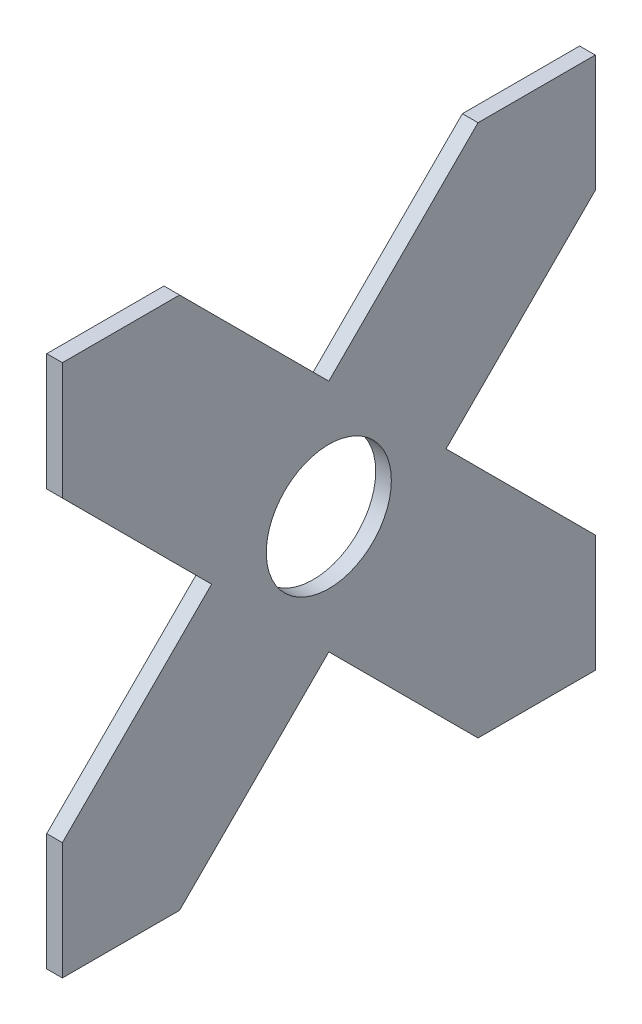
ISO-10303-21;
HEADER;
FILE_DESCRIPTION(('STEP AP214'),'2;1');
FILE_NAME('part.step','',(''),(''),'','','');
FILE_SCHEMA(('AUTOMOTIVE_DESIGN { 1 0 10303 214 1 1 1 1 }'));
ENDSEC;
DATA;
#1=APPLICATION_CONTEXT('core data for automotive mechanical design processes');
#2=APPLICATION_PROTOCOL_DEFINITION('international standard','automotive_design',2000,#1);
#3=PRODUCT_CONTEXT('',#1,'mechanical');
#4=PRODUCT('Part','Part','',(#3));
#5=PRODUCT_RELATED_PRODUCT_CATEGORY('part','',(#4));
#6=PRODUCT_DEFINITION_FORMATION('','',#4);
#7=PRODUCT_DEFINITION_CONTEXT('part definition',#1,'design');
#8=PRODUCT_DEFINITION('design','',#6,#7);
#9=PRODUCT_DEFINITION_SHAPE('','',#8);
#10=(LENGTH_UNIT() NAMED_UNIT(*) SI_UNIT(.MILLI.,.METRE.));
#11=(NAMED_UNIT(*) PLANE_ANGLE_UNIT() SI_UNIT($,.RADIAN.));
#12=(NAMED_UNIT(*) SI_UNIT($,.STERADIAN.) SOLID_ANGLE_UNIT());
#13=UNCERTAINTY_MEASURE_WITH_UNIT(LENGTH_MEASURE(1.E-05),#10,'distance_accuracy_value','');
#14=(GEOMETRIC_REPRESENTATION_CONTEXT(3) GLOBAL_UNCERTAINTY_ASSIGNED_CONTEXT((#13)) GLOBAL_UNIT_ASSIGNED_CONTEXT((#10,
#11,#12)) REPRESENTATION_CONTEXT('',''));
#15=CARTESIAN_POINT('',(0.,0.,0.));
#16=DIRECTION('',(0.,0.,1.));
#17=DIRECTION('',(1.,0.,0.));
#18=AXIS2_PLACEMENT_3D('',#15,#16,#17);
#19=CARTESIAN_POINT('',(10.,0.,0.));
#20=DIRECTION('',(0.,0.,-1.));
#21=DIRECTION('',(0.,1.,0.));
#22=AXIS2_PLACEMENT_3D('',#19,#20,#21);
#23=PLANE('',#22);
#24=DIRECTION('',(0.,-1.,0.));
#25=VECTOR('',#24,1.);
#26=CARTESIAN_POINT('',(0.,0.,0.));
#27=LINE('',#26,#25);
#28=CARTESIAN_POINT('',(0.,75.,0.));
#29=VERTEX_POINT('',#28);
#30=CARTESIAN_POINT('',(0.,0.,0.));
#31=VERTEX_POINT('',#30);
#32=EDGE_CURVE('E181',#29,#31,#27,.T.);
#33=ORIENTED_EDGE('',*,*,#32,.T.);
#34=DIRECTION('',(-1.,0.,0.));
#35=VECTOR('',#34,1.);
#36=CARTESIAN_POINT('',(10.,0.,0.));
#37=LINE('',#36,#35);
#38=CARTESIAN_POINT('',(10.,0.,0.));
#39=VERTEX_POINT('',#38);
#40=EDGE_CURVE('E11',#39,#31,#37,.T.);
#41=ORIENTED_EDGE('',*,*,#40,.F.);
#42=DIRECTION('',(0.,-1.,0.));
#43=VECTOR('',#42,1.);
#44=CARTESIAN_POINT('',(10.,0.,0.));
#45=LINE('',#44,#43);
#46=CARTESIAN_POINT('',(10.,75.,0.));
#47=VERTEX_POINT('',#46);
#48=EDGE_CURVE('E212',#47,#39,#45,.T.);
#49=ORIENTED_EDGE('',*,*,#48,.F.);
#50=DIRECTION('',(-1.,0.,0.));
#51=VECTOR('',#50,1.);
#52=CARTESIAN_POINT('',(10.,75.,0.));
#53=LINE('',#52,#51);
#54=EDGE_CURVE('E177',#47,#29,#53,.T.);
#55=ORIENTED_EDGE('',*,*,#54,.T.);
#56=EDGE_LOOP('',(#33,#41,#49,#55));
#57=FACE_BOUND('',#56,.T.);
#58=ADVANCED_FACE('F37',(#57),#23,.F.);
#59=CARTESIAN_POINT('',(10.,0.,0.));
#60=DIRECTION('',(0.,1.,0.));
#61=DIRECTION('',(0.,0.,1.));
#62=AXIS2_PLACEMENT_3D('',#59,#60,#61);
#63=PLANE('',#62);
#64=DIRECTION('',(0.,0.,-1.));
#65=VECTOR('',#64,1.);
#66=CARTESIAN_POINT('',(0.,0.,0.));
#67=LINE('',#66,#65);
#68=CARTESIAN_POINT('',(0.,0.,-75.));
#69=VERTEX_POINT('',#68);
#70=EDGE_CURVE('E184',#31,#69,#67,.T.);
#71=ORIENTED_EDGE('',*,*,#70,.T.);
#72=DIRECTION('',(-1.,0.,0.));
#73=VECTOR('',#72,1.);
#74=CARTESIAN_POINT('',(10.,0.,-75.));
#75=LINE('',#74,#73);
#76=CARTESIAN_POINT('',(10.,0.,-75.));
#77=VERTEX_POINT('',#76);
#78=EDGE_CURVE('E45',#77,#69,#75,.T.);
#79=ORIENTED_EDGE('',*,*,#78,.F.);
#80=DIRECTION('',(0.,0.,-1.));
#81=VECTOR('',#80,1.);
#82=CARTESIAN_POINT('',(10.,0.,0.));
#83=LINE('',#82,#81);
#84=EDGE_CURVE('E120',#39,#77,#83,.T.);
#85=ORIENTED_EDGE('',*,*,#84,.F.);
#86=ORIENTED_EDGE('',*,*,#40,.T.);
#87=EDGE_LOOP('',(#71,#79,#85,#86));
#88=FACE_BOUND('',#87,.T.);
#89=ADVANCED_FACE('F311',(#88),#63,.F.);
#90=CARTESIAN_POINT('',(10.,0.,-75.));
#91=DIRECTION('',(0.,0.707106781186547,0.707106781186548));
#92=DIRECTION('',(0.,-0.707106781186548,0.707106781186547));
#93=AXIS2_PLACEMENT_3D('',#90,#91,#92);
#94=PLANE('',#93);
#95=DIRECTION('',(0.,0.707106781186548,-0.707106781186547));
#96=VECTOR('',#95,1.);
#97=CARTESIAN_POINT('',(0.,0.,-75.));
#98=LINE('',#97,#96);
#99=CARTESIAN_POINT('',(0.,95.4594154601839,-170.459415460184));
#100=VERTEX_POINT('',#99);
#101=EDGE_CURVE('E187',#69,#100,#98,.T.);
#102=ORIENTED_EDGE('',*,*,#101,.T.);
#103=DIRECTION('',(-1.,0.,0.));
#104=VECTOR('',#103,1.);
#105=CARTESIAN_POINT('',(10.,95.4594154601839,-170.459415460184));
#106=LINE('',#105,#104);
#107=CARTESIAN_POINT('',(10.,95.4594154601839,-170.459415460184));
#108=VERTEX_POINT('',#107);
#109=EDGE_CURVE('E243',#108,#100,#106,.T.);
#110=ORIENTED_EDGE('',*,*,#109,.F.);
#111=DIRECTION('',(0.,0.707106781186548,-0.707106781186547));
#112=VECTOR('',#111,1.);
#113=CARTESIAN_POINT('',(10.,0.,-75.));
#114=LINE('',#113,#112);
#115=EDGE_CURVE('E251',#77,#108,#114,.T.);
#116=ORIENTED_EDGE('',*,*,#115,.F.);
#117=ORIENTED_EDGE('',*,*,#78,.T.);
#118=EDGE_LOOP('',(#102,#110,#116,#117));
#119=FACE_BOUND('',#118,.T.);
#120=ADVANCED_FACE('F249',(#119),#94,.F.);
#121=CARTESIAN_POINT('',(10.,0.,-265.918830920368));
#122=DIRECTION('',(0.,0.707106781186547,-0.707106781186548));
#123=DIRECTION('',(0.,0.707106781186548,0.707106781186547));
#124=AXIS2_PLACEMENT_3D('',#121,#122,#123);
#125=PLANE('',#124);
#126=DIRECTION('',(0.,-0.707106781186548,-0.707106781186547));
#127=VECTOR('',#126,1.);
#128=CARTESIAN_POINT('',(0.,0.,-265.918830920368));
#129=LINE('',#128,#127);
#130=CARTESIAN_POINT('',(0.,0.,-265.918830920368));
#131=VERTEX_POINT('',#130);
#132=EDGE_CURVE('E189',#100,#131,#129,.T.);
#133=ORIENTED_EDGE('',*,*,#132,.T.);
#134=DIRECTION('',(-1.,0.,0.));
#135=VECTOR('',#134,1.);
#136=CARTESIAN_POINT('',(10.,0.,-265.918830920368));
#137=LINE('',#136,#135);
#138=CARTESIAN_POINT('',(10.,0.,-265.918830920368));
#139=VERTEX_POINT('',#138);
#140=EDGE_CURVE('E240',#139,#131,#137,.T.);
#141=ORIENTED_EDGE('',*,*,#140,.F.);
#142=DIRECTION('',(0.,-0.707106781186548,-0.707106781186547));
#143=VECTOR('',#142,1.);
#144=CARTESIAN_POINT('',(10.,0.,-265.918830920368));
#145=LINE('',#144,#143);
#146=EDGE_CURVE('E269',#108,#139,#145,.T.);
#147=ORIENTED_EDGE('',*,*,#146,.F.);
#148=ORIENTED_EDGE('',*,*,#109,.T.);
#149=EDGE_LOOP('',(#133,#141,#147,#148));
#150=FACE_BOUND('',#149,.T.);
#151=ADVANCED_FACE('F260',(#150),#125,.F.);
#152=CARTESIAN_POINT('',(10.,0.,-340.918830920368));
#153=DIRECTION('',(0.,1.,0.));
#154=DIRECTION('',(0.,0.,1.));
#155=AXIS2_PLACEMENT_3D('',#152,#153,#154);
#156=PLANE('',#155);
#157=DIRECTION('',(0.,0.,-1.));
#158=VECTOR('',#157,1.);
#159=CARTESIAN_POINT('',(0.,0.,-340.918830920368));
#160=LINE('',#159,#158);
#161=CARTESIAN_POINT('',(0.,0.,-340.918830920368));
#162=VERTEX_POINT('',#161);
#163=EDGE_CURVE('E191',#131,#162,#160,.T.);
#164=ORIENTED_EDGE('',*,*,#163,.T.);
#165=DIRECTION('',(-1.,0.,0.));
#166=VECTOR('',#165,1.);
#167=CARTESIAN_POINT('',(10.,0.,-340.918830920368));
#168=LINE('',#167,#166);
#169=CARTESIAN_POINT('',(10.,0.,-340.918830920368));
#170=VERTEX_POINT('',#169);
#171=EDGE_CURVE('E237',#170,#162,#168,.T.);
#172=ORIENTED_EDGE('',*,*,#171,.F.);
#173=DIRECTION('',(0.,0.,-1.));
#174=VECTOR('',#173,1.);
#175=CARTESIAN_POINT('',(10.,0.,-340.918830920368));
#176=LINE('',#175,#174);
#177=EDGE_CURVE('E266',#139,#170,#176,.T.);
#178=ORIENTED_EDGE('',*,*,#177,.F.);
#179=ORIENTED_EDGE('',*,*,#140,.T.);
#180=EDGE_LOOP('',(#164,#172,#178,#179));
#181=FACE_BOUND('',#180,.T.);
#182=ADVANCED_FACE('F264',(#181),#156,.F.);
#183=CARTESIAN_POINT('',(10.,0.,-340.918830920368));
#184=DIRECTION('',(0.,0.,1.));
#185=DIRECTION('',(0.,-1.,0.));
#186=AXIS2_PLACEMENT_3D('',#183,#184,#185);
#187=PLANE('',#186);
#188=DIRECTION('',(0.,1.,0.));
#189=VECTOR('',#188,1.);
#190=CARTESIAN_POINT('',(0.,0.,-340.918830920368));
#191=LINE('',#190,#189);
#192=CARTESIAN_POINT('',(0.,75.,-340.918830920368));
#193=VERTEX_POINT('',#192);
#194=EDGE_CURVE('E193',#162,#193,#191,.T.);
#195=ORIENTED_EDGE('',*,*,#194,.T.);
#196=DIRECTION('',(-1.,0.,0.));
#197=VECTOR('',#196,1.);
#198=CARTESIAN_POINT('',(10.,75.,-340.918830920368));
#199=LINE('',#198,#197);
#200=CARTESIAN_POINT('',(10.,75.,-340.918830920368));
#201=VERTEX_POINT('',#200);
#202=EDGE_CURVE('E234',#201,#193,#199,.T.);
#203=ORIENTED_EDGE('',*,*,#202,.F.);
#204=DIRECTION('',(0.,1.,0.));
#205=VECTOR('',#204,1.);
#206=CARTESIAN_POINT('',(10.,0.,-340.918830920368));
#207=LINE('',#206,#205);
#208=EDGE_CURVE('E268',#170,#201,#207,.T.);
#209=ORIENTED_EDGE('',*,*,#208,.F.);
#210=ORIENTED_EDGE('',*,*,#171,.T.);
#211=EDGE_LOOP('',(#195,#203,#209,#210));
#212=FACE_BOUND('',#211,.T.);
#213=ADVANCED_FACE('F324',(#212),#187,.F.);
#214=CARTESIAN_POINT('',(10.,75.,-340.918830920368));
#215=DIRECTION('',(0.,-0.707106781186547,0.707106781186548));
#216=DIRECTION('',(0.,-0.707106781186548,-0.707106781186547));
#217=AXIS2_PLACEMENT_3D('',#214,#215,#216);
#218=PLANE('',#217);
#219=DIRECTION('',(0.,0.707106781186548,0.707106781186547));
#220=VECTOR('',#219,1.);
#221=CARTESIAN_POINT('',(0.,75.,-340.918830920368));
#222=LINE('',#221,#220);
#223=CARTESIAN_POINT('',(0.,170.459415460184,-245.459415460184));
#224=VERTEX_POINT('',#223);
#225=EDGE_CURVE('E195',#193,#224,#222,.T.);
#226=ORIENTED_EDGE('',*,*,#225,.T.);
#227=DIRECTION('',(-1.,0.,0.));
#228=VECTOR('',#227,1.);
#229=CARTESIAN_POINT('',(10.,170.459415460184,-245.459415460184));
#230=LINE('',#229,#228);
#231=CARTESIAN_POINT('',(10.,170.459415460184,-245.459415460184));
#232=VERTEX_POINT('',#231);
#233=EDGE_CURVE('E231',#232,#224,#230,.T.);
#234=ORIENTED_EDGE('',*,*,#233,.F.);
#235=DIRECTION('',(0.,0.707106781186548,0.707106781186547));
#236=VECTOR('',#235,1.);
#237=CARTESIAN_POINT('',(10.,75.,-340.918830920368));
#238=LINE('',#237,#236);
#239=EDGE_CURVE('E271',#201,#232,#238,.T.);
#240=ORIENTED_EDGE('',*,*,#239,.F.);
#241=ORIENTED_EDGE('',*,*,#202,.T.);
#242=EDGE_LOOP('',(#226,#234,#240,#241));
#243=FACE_BOUND('',#242,.T.);
#244=ADVANCED_FACE('F327',(#243),#218,.F.);
#245=CARTESIAN_POINT('',(10.,265.918830920368,-340.918830920368));
#246=DIRECTION('',(0.,0.707106781186547,0.707106781186548));
#247=DIRECTION('',(0.,-0.707106781186548,0.707106781186547));
#248=AXIS2_PLACEMENT_3D('',#245,#246,#247);
#249=PLANE('',#248);
#250=DIRECTION('',(0.,0.707106781186548,-0.707106781186547));
#251=VECTOR('',#250,1.);
#252=CARTESIAN_POINT('',(0.,265.918830920368,-340.918830920368));
#253=LINE('',#252,#251);
#254=CARTESIAN_POINT('',(0.,265.918830920368,-340.918830920368));
#255=VERTEX_POINT('',#254);
#256=EDGE_CURVE('E197',#224,#255,#253,.T.);
#257=ORIENTED_EDGE('',*,*,#256,.T.);
#258=DIRECTION('',(-1.,0.,0.));
#259=VECTOR('',#258,1.);
#260=CARTESIAN_POINT('',(10.,265.918830920368,-340.918830920368));
#261=LINE('',#260,#259);
#262=CARTESIAN_POINT('',(10.,265.918830920368,-340.918830920368));
#263=VERTEX_POINT('',#262);
#264=EDGE_CURVE('E228',#263,#255,#261,.T.);
#265=ORIENTED_EDGE('',*,*,#264,.F.);
#266=DIRECTION('',(0.,0.707106781186548,-0.707106781186547));
#267=VECTOR('',#266,1.);
#268=CARTESIAN_POINT('',(10.,265.918830920368,-340.918830920368));
#269=LINE('',#268,#267);
#270=EDGE_CURVE('E277',#232,#263,#269,.T.);
#271=ORIENTED_EDGE('',*,*,#270,.F.);
#272=ORIENTED_EDGE('',*,*,#233,.T.);
#273=EDGE_LOOP('',(#257,#265,#271,#272));
#274=FACE_BOUND('',#273,.T.);
#275=ADVANCED_FACE('F331',(#274),#249,.F.);
#276=CARTESIAN_POINT('',(10.,340.918830920368,-340.918830920368));
#277=DIRECTION('',(0.,0.,1.));
#278=DIRECTION('',(0.,-1.,0.));
#279=AXIS2_PLACEMENT_3D('',#276,#277,#278);
#280=PLANE('',#279);
#281=DIRECTION('',(0.,1.,0.));
#282=VECTOR('',#281,1.);
#283=CARTESIAN_POINT('',(0.,340.918830920368,-340.918830920368));
#284=LINE('',#283,#282);
#285=CARTESIAN_POINT('',(0.,340.918830920368,-340.918830920368));
#286=VERTEX_POINT('',#285);
#287=EDGE_CURVE('E199',#255,#286,#284,.T.);
#288=ORIENTED_EDGE('',*,*,#287,.T.);
#289=DIRECTION('',(-1.,0.,0.));
#290=VECTOR('',#289,1.);
#291=CARTESIAN_POINT('',(10.,340.918830920368,-340.918830920368));
#292=LINE('',#291,#290);
#293=CARTESIAN_POINT('',(10.,340.918830920368,-340.918830920368));
#294=VERTEX_POINT('',#293);
#295=EDGE_CURVE('E225',#294,#286,#292,.T.);
#296=ORIENTED_EDGE('',*,*,#295,.F.);
#297=DIRECTION('',(0.,1.,0.));
#298=VECTOR('',#297,1.);
#299=CARTESIAN_POINT('',(10.,340.918830920368,-340.918830920368));
#300=LINE('',#299,#298);
#301=EDGE_CURVE('E279',#263,#294,#300,.T.);
#302=ORIENTED_EDGE('',*,*,#301,.F.);
#303=ORIENTED_EDGE('',*,*,#264,.T.);
#304=EDGE_LOOP('',(#288,#296,#302,#303));
#305=FACE_BOUND('',#304,.T.);
#306=ADVANCED_FACE('F335',(#305),#280,.F.);
#307=CARTESIAN_POINT('',(10.,340.918830920368,-340.918830920368));
#308=DIRECTION('',(0.,-1.,0.));
#309=DIRECTION('',(0.,0.,-1.));
#310=AXIS2_PLACEMENT_3D('',#307,#308,#309);
#311=PLANE('',#310);
#312=DIRECTION('',(0.,0.,1.));
#313=VECTOR('',#312,1.);
#314=CARTESIAN_POINT('',(0.,340.918830920368,-340.918830920368));
#315=LINE('',#314,#313);
#316=CARTESIAN_POINT('',(0.,340.918830920368,-265.918830920368));
#317=VERTEX_POINT('',#316);
#318=EDGE_CURVE('E201',#286,#317,#315,.T.);
#319=ORIENTED_EDGE('',*,*,#318,.T.);
#320=DIRECTION('',(-1.,0.,0.));
#321=VECTOR('',#320,1.);
#322=CARTESIAN_POINT('',(10.,340.918830920368,-265.918830920368));
#323=LINE('',#322,#321);
#324=CARTESIAN_POINT('',(10.,340.918830920368,-265.918830920368));
#325=VERTEX_POINT('',#324);
#326=EDGE_CURVE('E222',#325,#317,#323,.T.);
#327=ORIENTED_EDGE('',*,*,#326,.F.);
#328=DIRECTION('',(0.,0.,1.));
#329=VECTOR('',#328,1.);
#330=CARTESIAN_POINT('',(10.,340.918830920368,-340.918830920368));
#331=LINE('',#330,#329);
#332=EDGE_CURVE('E281',#294,#325,#331,.T.);
#333=ORIENTED_EDGE('',*,*,#332,.F.);
#334=ORIENTED_EDGE('',*,*,#295,.T.);
#335=EDGE_LOOP('',(#319,#327,#333,#334));
#336=FACE_BOUND('',#335,.T.);
#337=ADVANCED_FACE('F339',(#336),#311,.F.);
#338=CARTESIAN_POINT('',(10.,340.918830920368,-265.918830920368));
#339=DIRECTION('',(0.,-0.707106781186547,-0.707106781186548));
#340=DIRECTION('',(0.,0.707106781186548,-0.707106781186547));
#341=AXIS2_PLACEMENT_3D('',#338,#339,#340);
#342=PLANE('',#341);
#343=DIRECTION('',(0.,-0.707106781186548,0.707106781186547));
#344=VECTOR('',#343,1.);
#345=CARTESIAN_POINT('',(0.,340.918830920368,-265.918830920368));
#346=LINE('',#345,#344);
#347=CARTESIAN_POINT('',(0.,245.459415460184,-170.459415460184));
#348=VERTEX_POINT('',#347);
#349=EDGE_CURVE('E203',#317,#348,#346,.T.);
#350=ORIENTED_EDGE('',*,*,#349,.T.);
#351=DIRECTION('',(-1.,0.,0.));
#352=VECTOR('',#351,1.);
#353=CARTESIAN_POINT('',(10.,245.459415460184,-170.459415460184));
#354=LINE('',#353,#352);
#355=CARTESIAN_POINT('',(10.,245.459415460184,-170.459415460184));
#356=VERTEX_POINT('',#355);
#357=EDGE_CURVE('E219',#356,#348,#354,.T.);
#358=ORIENTED_EDGE('',*,*,#357,.F.);
#359=DIRECTION('',(0.,-0.707106781186548,0.707106781186547));
#360=VECTOR('',#359,1.);
#361=CARTESIAN_POINT('',(10.,340.918830920368,-265.918830920368));
#362=LINE('',#361,#360);
#363=EDGE_CURVE('E283',#325,#356,#362,.T.);
#364=ORIENTED_EDGE('',*,*,#363,.F.);
#365=ORIENTED_EDGE('',*,*,#326,.T.);
#366=EDGE_LOOP('',(#350,#358,#364,#365));
#367=FACE_BOUND('',#366,.T.);
#368=ADVANCED_FACE('F343',(#367),#342,.F.);
#369=CARTESIAN_POINT('',(10.,340.918830920368,-75.));
#370=DIRECTION('',(0.,-0.707106781186547,0.707106781186548));
#371=DIRECTION('',(0.,-0.707106781186548,-0.707106781186547));
#372=AXIS2_PLACEMENT_3D('',#369,#370,#371);
#373=PLANE('',#372);
#374=DIRECTION('',(0.,0.707106781186548,0.707106781186547));
#375=VECTOR('',#374,1.);
#376=CARTESIAN_POINT('',(0.,340.918830920368,-75.));
#377=LINE('',#376,#375);
#378=CARTESIAN_POINT('',(0.,340.918830920368,-75.));
#379=VERTEX_POINT('',#378);
#380=EDGE_CURVE('E205',#348,#379,#377,.T.);
#381=ORIENTED_EDGE('',*,*,#380,.T.);
#382=DIRECTION('',(-1.,0.,0.));
#383=VECTOR('',#382,1.);
#384=CARTESIAN_POINT('',(10.,340.918830920368,-75.));
#385=LINE('',#384,#383);
#386=CARTESIAN_POINT('',(10.,340.918830920368,-75.));
#387=VERTEX_POINT('',#386);
#388=EDGE_CURVE('E216',#387,#379,#385,.T.);
#389=ORIENTED_EDGE('',*,*,#388,.F.);
#390=DIRECTION('',(0.,0.707106781186548,0.707106781186547));
#391=VECTOR('',#390,1.);
#392=CARTESIAN_POINT('',(10.,340.918830920368,-75.));
#393=LINE('',#392,#391);
#394=EDGE_CURVE('E285',#356,#387,#393,.T.);
#395=ORIENTED_EDGE('',*,*,#394,.F.);
#396=ORIENTED_EDGE('',*,*,#357,.T.);
#397=EDGE_LOOP('',(#381,#389,#395,#396));
#398=FACE_BOUND('',#397,.T.);
#399=ADVANCED_FACE('F291',(#398),#373,.F.);
#400=CARTESIAN_POINT('',(10.,340.918830920368,0.));
#401=DIRECTION('',(0.,-1.,0.));
#402=DIRECTION('',(0.,0.,-1.));
#403=AXIS2_PLACEMENT_3D('',#400,#401,#402);
#404=PLANE('',#403);
#405=DIRECTION('',(0.,0.,1.));
#406=VECTOR('',#405,1.);
#407=CARTESIAN_POINT('',(0.,340.918830920368,0.));
#408=LINE('',#407,#406);
#409=CARTESIAN_POINT('',(0.,340.918830920368,0.));
#410=VERTEX_POINT('',#409);
#411=EDGE_CURVE('E207',#379,#410,#408,.T.);
#412=ORIENTED_EDGE('',*,*,#411,.T.);
#413=DIRECTION('',(-1.,0.,0.));
#414=VECTOR('',#413,1.);
#415=CARTESIAN_POINT('',(10.,340.918830920368,0.));
#416=LINE('',#415,#414);
#417=CARTESIAN_POINT('',(10.,340.918830920368,0.));
#418=VERTEX_POINT('',#417);
#419=EDGE_CURVE('E172',#418,#410,#416,.T.);
#420=ORIENTED_EDGE('',*,*,#419,.F.);
#421=DIRECTION('',(0.,0.,1.));
#422=VECTOR('',#421,1.);
#423=CARTESIAN_POINT('',(10.,340.918830920368,0.));
#424=LINE('',#423,#422);
#425=EDGE_CURVE('E163',#387,#418,#424,.T.);
#426=ORIENTED_EDGE('',*,*,#425,.F.);
#427=ORIENTED_EDGE('',*,*,#388,.T.);
#428=EDGE_LOOP('',(#412,#420,#426,#427));
#429=FACE_BOUND('',#428,.T.);
#430=ADVANCED_FACE('F295',(#429),#404,.F.);
#431=CARTESIAN_POINT('',(10.,340.918830920368,0.));
#432=DIRECTION('',(0.,0.,-1.));
#433=DIRECTION('',(0.,1.,0.));
#434=AXIS2_PLACEMENT_3D('',#431,#432,#433);
#435=PLANE('',#434);
#436=DIRECTION('',(0.,-1.,0.));
#437=VECTOR('',#436,1.);
#438=CARTESIAN_POINT('',(0.,340.918830920368,0.));
#439=LINE('',#438,#437);
#440=CARTESIAN_POINT('',(0.,265.918830920368,0.));
#441=VERTEX_POINT('',#440);
#442=EDGE_CURVE('E171',#410,#441,#439,.T.);
#443=ORIENTED_EDGE('',*,*,#442,.T.);
#444=DIRECTION('',(-1.,0.,0.));
#445=VECTOR('',#444,1.);
#446=CARTESIAN_POINT('',(10.,265.918830920368,0.));
#447=LINE('',#446,#445);
#448=CARTESIAN_POINT('',(10.,265.918830920368,0.));
#449=VERTEX_POINT('',#448);
#450=EDGE_CURVE('E168',#449,#441,#447,.T.);
#451=ORIENTED_EDGE('',*,*,#450,.F.);
#452=DIRECTION('',(0.,-1.,0.));
#453=VECTOR('',#452,1.);
#454=CARTESIAN_POINT('',(10.,340.918830920368,0.));
#455=LINE('',#454,#453);
#456=EDGE_CURVE('E157',#418,#449,#455,.T.);
#457=ORIENTED_EDGE('',*,*,#456,.F.);
#458=ORIENTED_EDGE('',*,*,#419,.T.);
#459=EDGE_LOOP('',(#443,#451,#457,#458));
#460=FACE_BOUND('',#459,.T.);
#461=ADVANCED_FACE('F169',(#460),#435,.F.);
#462=CARTESIAN_POINT('',(10.,265.918830920368,0.));
#463=DIRECTION('',(0.,0.707106781186547,-0.707106781186548));
#464=DIRECTION('',(0.,0.707106781186548,0.707106781186547));
#465=AXIS2_PLACEMENT_3D('',#462,#463,#464);
#466=PLANE('',#465);
#467=DIRECTION('',(0.,-0.707106781186548,-0.707106781186547));
#468=VECTOR('',#467,1.);
#469=CARTESIAN_POINT('',(0.,265.918830920368,0.));
#470=LINE('',#469,#468);
#471=CARTESIAN_POINT('',(0.,170.459415460184,-95.4594154601838));
#472=VERTEX_POINT('',#471);
#473=EDGE_CURVE('E106',#441,#472,#470,.T.);
#474=ORIENTED_EDGE('',*,*,#473,.T.);
#475=DIRECTION('',(-1.,0.,0.));
#476=VECTOR('',#475,1.);
#477=CARTESIAN_POINT('',(10.,170.459415460184,-95.4594154601838));
#478=LINE('',#477,#476);
#479=CARTESIAN_POINT('',(10.,170.459415460184,-95.4594154601838));
#480=VERTEX_POINT('',#479);
#481=EDGE_CURVE('E173',#480,#472,#478,.T.);
#482=ORIENTED_EDGE('',*,*,#481,.F.);
#483=DIRECTION('',(0.,-0.707106781186548,-0.707106781186547));
#484=VECTOR('',#483,1.);
#485=CARTESIAN_POINT('',(10.,265.918830920368,0.));
#486=LINE('',#485,#484);
#487=EDGE_CURVE('E161',#449,#480,#486,.T.);
#488=ORIENTED_EDGE('',*,*,#487,.F.);
#489=ORIENTED_EDGE('',*,*,#450,.T.);
#490=EDGE_LOOP('',(#474,#482,#488,#489));
#491=FACE_BOUND('',#490,.T.);
#492=ADVANCED_FACE('F175',(#491),#466,.F.);
#493=CARTESIAN_POINT('',(10.,75.,0.));
#494=DIRECTION('',(0.,-0.707106781186547,-0.707106781186548));
#495=DIRECTION('',(0.,0.707106781186548,-0.707106781186547));
#496=AXIS2_PLACEMENT_3D('',#493,#494,#495);
#497=PLANE('',#496);
#498=DIRECTION('',(0.,-0.707106781186548,0.707106781186547));
#499=VECTOR('',#498,1.);
#500=CARTESIAN_POINT('',(0.,75.,0.));
#501=LINE('',#500,#499);
#502=EDGE_CURVE('E112',#472,#29,#501,.T.);
#503=ORIENTED_EDGE('',*,*,#502,.T.);
#504=ORIENTED_EDGE('',*,*,#54,.F.);
#505=DIRECTION('',(0.,-0.707106781186548,0.707106781186547));
#506=VECTOR('',#505,1.);
#507=CARTESIAN_POINT('',(10.,75.,0.));
#508=LINE('',#507,#506);
#509=EDGE_CURVE('E53',#480,#47,#508,.T.);
#510=ORIENTED_EDGE('',*,*,#509,.F.);
#511=ORIENTED_EDGE('',*,*,#481,.T.);
#512=EDGE_LOOP('',(#503,#504,#510,#511));
#513=FACE_BOUND('',#512,.T.);
#514=ADVANCED_FACE('F299',(#513),#497,.F.);
#515=CARTESIAN_POINT('',(10.,0.,0.));
#516=DIRECTION('',(-1.,0.,0.));
#517=DIRECTION('',(0.,0.,1.));
#518=AXIS2_PLACEMENT_3D('',#515,#516,#517);
#519=PLANE('',#518);
#520=CARTESIAN_POINT('',(10.,170.459415460184,-170.459415460184));
#521=DIRECTION('',(1.,0.,0.));
#522=DIRECTION('',(0.,0.,-1.));
#523=AXIS2_PLACEMENT_3D('',#520,#521,#522);
#524=CIRCLE('',#523,40.);
#525=CARTESIAN_POINT('',(10.,170.459415460184,-210.459415460184));
#526=VERTEX_POINT('',#525);
#527=EDGE_CURVE('E398',#526,#526,#524,.T.);
#528=ORIENTED_EDGE('',*,*,#527,.F.);
#529=EDGE_LOOP('',(#528));
#530=FACE_BOUND('',#529,.T.);
#531=ORIENTED_EDGE('',*,*,#48,.T.);
#532=ORIENTED_EDGE('',*,*,#84,.T.);
#533=ORIENTED_EDGE('',*,*,#115,.T.);
#534=ORIENTED_EDGE('',*,*,#146,.T.);
#535=ORIENTED_EDGE('',*,*,#177,.T.);
#536=ORIENTED_EDGE('',*,*,#208,.T.);
#537=ORIENTED_EDGE('',*,*,#239,.T.);
#538=ORIENTED_EDGE('',*,*,#270,.T.);
#539=ORIENTED_EDGE('',*,*,#301,.T.);
#540=ORIENTED_EDGE('',*,*,#332,.T.);
#541=ORIENTED_EDGE('',*,*,#363,.T.);
#542=ORIENTED_EDGE('',*,*,#394,.T.);
#543=ORIENTED_EDGE('',*,*,#425,.T.);
#544=ORIENTED_EDGE('',*,*,#456,.T.);
#545=ORIENTED_EDGE('',*,*,#487,.T.);
#546=ORIENTED_EDGE('',*,*,#509,.T.);
#547=EDGE_LOOP('',(#531,#532,#533,#534,#535,#536,#537,#538,#539,#540,#541,#542,#543,#544,#545,#546));
#548=FACE_BOUND('',#547,.T.);
#549=ADVANCED_FACE('F159',(#530,#548),#519,.F.);
#550=CARTESIAN_POINT('',(0.,0.,0.));
#551=DIRECTION('',(-1.,0.,0.));
#552=DIRECTION('',(0.,0.,1.));
#553=AXIS2_PLACEMENT_3D('',#550,#551,#552);
#554=PLANE('',#553);
#555=CARTESIAN_POINT('',(0.,170.459415460184,-170.459415460184));
#556=DIRECTION('',(1.,0.,0.));
#557=DIRECTION('',(0.,0.,-1.));
#558=AXIS2_PLACEMENT_3D('',#555,#556,#557);
#559=CIRCLE('',#558,40.);
#560=CARTESIAN_POINT('',(0.,170.459415460184,-210.459415460184));
#561=VERTEX_POINT('',#560);
#562=EDGE_CURVE('E185',#561,#561,#559,.T.);
#563=ORIENTED_EDGE('',*,*,#562,.T.);
#564=EDGE_LOOP('',(#563));
#565=FACE_BOUND('',#564,.T.);
#566=ORIENTED_EDGE('',*,*,#32,.F.);
#567=ORIENTED_EDGE('',*,*,#502,.F.);
#568=ORIENTED_EDGE('',*,*,#473,.F.);
#569=ORIENTED_EDGE('',*,*,#442,.F.);
#570=ORIENTED_EDGE('',*,*,#411,.F.);
#571=ORIENTED_EDGE('',*,*,#380,.F.);
#572=ORIENTED_EDGE('',*,*,#349,.F.);
#573=ORIENTED_EDGE('',*,*,#318,.F.);
#574=ORIENTED_EDGE('',*,*,#287,.F.);
#575=ORIENTED_EDGE('',*,*,#256,.F.);
#576=ORIENTED_EDGE('',*,*,#225,.F.);
#577=ORIENTED_EDGE('',*,*,#194,.F.);
#578=ORIENTED_EDGE('',*,*,#163,.F.);
#579=ORIENTED_EDGE('',*,*,#132,.F.);
#580=ORIENTED_EDGE('',*,*,#101,.F.);
#581=ORIENTED_EDGE('',*,*,#70,.F.);
#582=EDGE_LOOP('',(#566,#567,#568,#569,#570,#571,#572,#573,#574,#575,#576,#577,#578,#579,#580,#581));
#583=FACE_BOUND('',#582,.T.);
#584=ADVANCED_FACE('F255',(#565,#583),#554,.T.);
#585=CARTESIAN_POINT('',(0.,170.459415460184,-170.459415460184));
#586=DIRECTION('',(1.,0.,0.));
#587=DIRECTION('',(0.,0.,-1.));
#588=AXIS2_PLACEMENT_3D('',#585,#586,#587);
#589=CYLINDRICAL_SURFACE('',#588,40.);
#590=ORIENTED_EDGE('',*,*,#562,.F.);
#591=EDGE_LOOP('',(#590));
#592=FACE_BOUND('',#591,.T.);
#593=ORIENTED_EDGE('',*,*,#527,.T.);
#594=EDGE_LOOP('',(#593));
#595=FACE_BOUND('',#594,.T.);
#596=ADVANCED_FACE('F380',(#592,#595),#589,.F.);
#597=CLOSED_SHELL('',(#58,#89,#120,#151,#182,#213,#244,#275,#306,#337,#368,#399,#430,#461,#492,
#514,#549,#584,#596));
#598=MANIFOLD_SOLID_BREP('B2',#597);
#599=ADVANCED_BREP_SHAPE_REPRESENTATION('',(#18,#598),#14);
#600=SHAPE_DEFINITION_REPRESENTATION(#9,#599);
ENDSEC;
END-ISO-10303-21;
